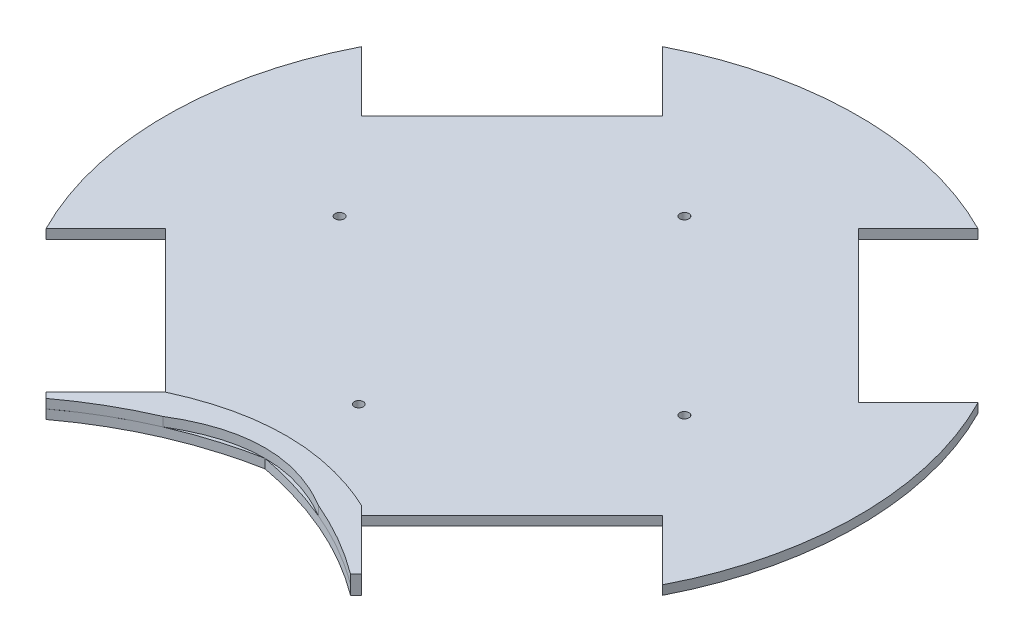
ISO-10303-21;
HEADER;
FILE_DESCRIPTION(('STEP AP214'),'2;1');
FILE_NAME('part.step','',(''),(''),'','','');
FILE_SCHEMA(('AUTOMOTIVE_DESIGN { 1 0 10303 214 1 1 1 1 }'));
ENDSEC;
DATA;
#1=APPLICATION_CONTEXT('core data for automotive mechanical design processes');
#2=APPLICATION_PROTOCOL_DEFINITION('international standard','automotive_design',2000,#1);
#3=PRODUCT_CONTEXT('',#1,'mechanical');
#4=PRODUCT('Part','Part','',(#3));
#5=PRODUCT_RELATED_PRODUCT_CATEGORY('part','',(#4));
#6=PRODUCT_DEFINITION_FORMATION('','',#4);
#7=PRODUCT_DEFINITION_CONTEXT('part definition',#1,'design');
#8=PRODUCT_DEFINITION('design','',#6,#7);
#9=PRODUCT_DEFINITION_SHAPE('','',#8);
#10=(LENGTH_UNIT() NAMED_UNIT(*) SI_UNIT(.MILLI.,.METRE.));
#11=(NAMED_UNIT(*) PLANE_ANGLE_UNIT() SI_UNIT($,.RADIAN.));
#12=(NAMED_UNIT(*) SI_UNIT($,.STERADIAN.) SOLID_ANGLE_UNIT());
#13=UNCERTAINTY_MEASURE_WITH_UNIT(LENGTH_MEASURE(1.E-05),#10,'distance_accuracy_value','');
#14=(GEOMETRIC_REPRESENTATION_CONTEXT(3) GLOBAL_UNCERTAINTY_ASSIGNED_CONTEXT((#13)) GLOBAL_UNIT_ASSIGNED_CONTEXT((#10,
#11,#12)) REPRESENTATION_CONTEXT('',''));
#15=CARTESIAN_POINT('',(0.,0.,0.));
#16=DIRECTION('',(0.,0.,1.));
#17=DIRECTION('',(1.,0.,0.));
#18=AXIS2_PLACEMENT_3D('',#15,#16,#17);
#19=CARTESIAN_POINT('',(0.,3.,0.));
#20=DIRECTION('',(0.,1.,0.));
#21=DIRECTION('',(0.,0.,1.));
#22=AXIS2_PLACEMENT_3D('',#19,#20,#21);
#23=PLANE('',#22);
#24=CARTESIAN_POINT('',(-56.6309432949497,3.,0.));
#25=DIRECTION('',(0.,1.,0.));
#26=DIRECTION('',(0.,0.,1.));
#27=AXIS2_PLACEMENT_3D('',#24,#25,#26);
#28=CIRCLE('',#27,1.5);
#29=CARTESIAN_POINT('',(-56.6309432949497,3.,1.5));
#30=VERTEX_POINT('',#29);
#31=EDGE_CURVE('E961',#30,#30,#28,.T.);
#32=ORIENTED_EDGE('',*,*,#31,.F.);
#33=EDGE_LOOP('',(#32));
#34=FACE_BOUND('',#33,.T.);
#35=CARTESIAN_POINT('',(0.,3.,50.3357666781897));
#36=DIRECTION('',(0.,1.,0.));
#37=DIRECTION('',(0.,0.,1.));
#38=AXIS2_PLACEMENT_3D('',#35,#36,#37);
#39=CIRCLE('',#38,1.5);
#40=CARTESIAN_POINT('',(0.,3.,51.8357666781897));
#41=VERTEX_POINT('',#40);
#42=EDGE_CURVE('E969',#41,#41,#39,.T.);
#43=ORIENTED_EDGE('',*,*,#42,.F.);
#44=EDGE_LOOP('',(#43));
#45=FACE_BOUND('',#44,.T.);
#46=CARTESIAN_POINT('',(56.6309432949495,3.,0.));
#47=DIRECTION('',(0.,1.,0.));
#48=DIRECTION('',(0.,0.,1.));
#49=AXIS2_PLACEMENT_3D('',#46,#47,#48);
#50=CIRCLE('',#49,1.5);
#51=CARTESIAN_POINT('',(56.6309432949495,3.,1.50000000000001));
#52=VERTEX_POINT('',#51);
#53=EDGE_CURVE('E975',#52,#52,#50,.T.);
#54=ORIENTED_EDGE('',*,*,#53,.F.);
#55=EDGE_LOOP('',(#54));
#56=FACE_BOUND('',#55,.T.);
#57=CARTESIAN_POINT('',(0.,3.,-56.6309432949497));
#58=DIRECTION('',(0.,1.,0.));
#59=DIRECTION('',(0.,0.,1.));
#60=AXIS2_PLACEMENT_3D('',#57,#58,#59);
#61=CIRCLE('',#60,1.5);
#62=CARTESIAN_POINT('',(0.,3.,-55.1309432949497));
#63=VERTEX_POINT('',#62);
#64=EDGE_CURVE('E980',#63,#63,#61,.T.);
#65=ORIENTED_EDGE('',*,*,#64,.F.);
#66=EDGE_LOOP('',(#65));
#67=FACE_BOUND('',#66,.T.);
#68=DIRECTION('',(-0.707106781186548,0.,-0.707106781186548));
#69=VECTOR('',#68,1.);
#70=CARTESIAN_POINT('',(-56.8822059534205,3.,56.8822059534205));
#71=LINE('',#70,#69);
#72=CARTESIAN_POINT('',(-32.1334686118914,3.,81.6309432949497));
#73=VERTEX_POINT('',#72);
#74=CARTESIAN_POINT('',(-81.6309432949497,3.,32.1334686118914));
#75=VERTEX_POINT('',#74);
#76=EDGE_CURVE('E574',#73,#75,#71,.T.);
#77=ORIENTED_EDGE('',*,*,#76,.F.);
#78=CARTESIAN_POINT('',(-32.1334686118914,3.,81.6309432949497));
#79=CARTESIAN_POINT('',(0.,3.,66.7397090012531));
#80=CARTESIAN_POINT('',(32.1334686118914,3.,81.6309432949497));
#81=B_SPLINE_CURVE_WITH_KNOTS('',2,(#78,#79,#80),.UNSPECIFIED.,.F.,.F.,(3,3),(0.,1.),.UNSPECIFIED.);
#82=CARTESIAN_POINT('',(32.1334686118914,3.,81.6309432949497));
#83=VERTEX_POINT('',#82);
#84=EDGE_CURVE('E353',#73,#83,#81,.T.);
#85=ORIENTED_EDGE('',*,*,#84,.T.);
#86=DIRECTION('',(-0.707106781186548,0.,0.707106781186548));
#87=VECTOR('',#86,1.);
#88=CARTESIAN_POINT('',(56.8822059534205,3.,56.8822059534205));
#89=LINE('',#88,#87);
#90=CARTESIAN_POINT('',(81.6309432949497,3.,32.1334686118913));
#91=VERTEX_POINT('',#90);
#92=EDGE_CURVE('E577',#91,#83,#89,.T.);
#93=ORIENTED_EDGE('',*,*,#92,.F.);
#94=DIRECTION('',(0.707106781186548,0.,0.707106781186548));
#95=VECTOR('',#94,1.);
#96=CARTESIAN_POINT('',(24.7487373415292,3.,-24.7487373415292));
#97=LINE('',#96,#95);
#98=CARTESIAN_POINT('',(101.290691250838,3.,51.7932165677793));
#99=VERTEX_POINT('',#98);
#100=EDGE_CURVE('E580',#91,#99,#97,.T.);
#101=ORIENTED_EDGE('',*,*,#100,.T.);
#102=CARTESIAN_POINT('',(0.,3.,0.));
#103=DIRECTION('',(0.,1.,0.));
#104=DIRECTION('',(0.,0.,1.));
#105=AXIS2_PLACEMENT_3D('',#102,#103,#104);
#106=CIRCLE('',#105,113.764411906841);
#107=CARTESIAN_POINT('',(101.290691250837,3.,-51.7932165677795));
#108=VERTEX_POINT('',#107);
#109=EDGE_CURVE('E582',#99,#108,#106,.T.);
#110=ORIENTED_EDGE('',*,*,#109,.T.);
#111=DIRECTION('',(0.707106781186546,0.,-0.707106781186549));
#112=VECTOR('',#111,1.);
#113=CARTESIAN_POINT('',(24.7487373415291,3.,24.748737341529));
#114=LINE('',#113,#112);
#115=CARTESIAN_POINT('',(81.6309432949495,3.,-32.1334686118916));
#116=VERTEX_POINT('',#115);
#117=EDGE_CURVE('E550',#116,#108,#114,.T.);
#118=ORIENTED_EDGE('',*,*,#117,.F.);
#119=DIRECTION('',(0.707106781186548,0.,0.707106781186548));
#120=VECTOR('',#119,1.);
#121=CARTESIAN_POINT('',(56.8822059534205,3.,-56.8822059534205));
#122=LINE('',#121,#120);
#123=CARTESIAN_POINT('',(32.1334686118912,3.,-81.6309432949499));
#124=VERTEX_POINT('',#123);
#125=EDGE_CURVE('E553',#124,#116,#122,.T.);
#126=ORIENTED_EDGE('',*,*,#125,.F.);
#127=DIRECTION('',(0.707106781186546,0.,-0.707106781186549));
#128=VECTOR('',#127,1.);
#129=CARTESIAN_POINT('',(-24.7487373415293,3.,-24.7487373415292));
#130=LINE('',#129,#128);
#131=CARTESIAN_POINT('',(51.793216567779,3.,-101.290691250838));
#132=VERTEX_POINT('',#131);
#133=EDGE_CURVE('E557',#124,#132,#130,.T.);
#134=ORIENTED_EDGE('',*,*,#133,.T.);
#135=CARTESIAN_POINT('',(0.,3.,0.));
#136=DIRECTION('',(0.,1.,0.));
#137=DIRECTION('',(0.,0.,1.));
#138=AXIS2_PLACEMENT_3D('',#135,#136,#137);
#139=CIRCLE('',#138,113.764411906841);
#140=CARTESIAN_POINT('',(-51.7932165677792,3.,-101.290691250838));
#141=VERTEX_POINT('',#140);
#142=EDGE_CURVE('E559',#132,#141,#139,.T.);
#143=ORIENTED_EDGE('',*,*,#142,.T.);
#144=DIRECTION('',(-0.707106781186547,0.,-0.707106781186548));
#145=VECTOR('',#144,1.);
#146=CARTESIAN_POINT('',(24.7487373415292,3.,-24.7487373415292));
#147=LINE('',#146,#145);
#148=CARTESIAN_POINT('',(-32.1334686118913,3.,-81.6309432949497));
#149=VERTEX_POINT('',#148);
#150=EDGE_CURVE('E561',#149,#141,#147,.T.);
#151=ORIENTED_EDGE('',*,*,#150,.F.);
#152=DIRECTION('',(0.707106781186548,0.,-0.707106781186548));
#153=VECTOR('',#152,1.);
#154=CARTESIAN_POINT('',(-56.8822059534205,3.,-56.8822059534205));
#155=LINE('',#154,#153);
#156=CARTESIAN_POINT('',(-81.6309432949496,3.,-32.1334686118915));
#157=VERTEX_POINT('',#156);
#158=EDGE_CURVE('E564',#157,#149,#155,.T.);
#159=ORIENTED_EDGE('',*,*,#158,.F.);
#160=DIRECTION('',(-0.707106781186547,0.,-0.707106781186548));
#161=VECTOR('',#160,1.);
#162=CARTESIAN_POINT('',(-24.7487373415291,3.,24.7487373415291));
#163=LINE('',#162,#161);
#164=CARTESIAN_POINT('',(-101.290691250838,3.,-51.7932165677794));
#165=VERTEX_POINT('',#164);
#166=EDGE_CURVE('E567',#157,#165,#163,.T.);
#167=ORIENTED_EDGE('',*,*,#166,.T.);
#168=CARTESIAN_POINT('',(0.,3.,0.));
#169=DIRECTION('',(0.,1.,0.));
#170=DIRECTION('',(0.,0.,1.));
#171=AXIS2_PLACEMENT_3D('',#168,#169,#170);
#172=CIRCLE('',#171,113.764411906841);
#173=CARTESIAN_POINT('',(-101.290691250838,3.,51.7932165677793));
#174=VERTEX_POINT('',#173);
#175=EDGE_CURVE('E569',#165,#174,#172,.T.);
#176=ORIENTED_EDGE('',*,*,#175,.T.);
#177=DIRECTION('',(-0.707106781186547,0.,0.707106781186548));
#178=VECTOR('',#177,1.);
#179=CARTESIAN_POINT('',(-24.7487373415292,3.,-24.7487373415292));
#180=LINE('',#179,#178);
#181=EDGE_CURVE('E571',#75,#174,#180,.T.);
#182=ORIENTED_EDGE('',*,*,#181,.F.);
#183=EDGE_LOOP('',(#77,#85,#93,#101,#110,#118,#126,#134,#143,#151,#159,#167,#176,#182));
#184=FACE_BOUND('',#183,.T.);
#185=ADVANCED_FACE('F158',(#34,#45,#56,#67,#184),#23,.T.);
#186=CARTESIAN_POINT('',(-25.6595369959908,3.,88.957948864328));
#187=CARTESIAN_POINT('',(-0.319320436021414,3.,73.431682626745));
#188=CARTESIAN_POINT('',(25.0624008041194,3.,88.702011102713));
#189=B_SPLINE_CURVE_WITH_KNOTS('',2,(#186,#187,#188),.UNSPECIFIED.,.F.,.F.,(3,3),(0.,1.),.UNSPECIFIED.);
#190=CARTESIAN_POINT('',(-25.6595369960047,3.,88.9579488643403));
#191=VERTEX_POINT('',#190);
#192=CARTESIAN_POINT('',(2.21256346577547E-09,3.,81.1304149397444));
#193=VERTEX_POINT('',#192);
#194=EDGE_CURVE('E338',#191,#193,#189,.T.);
#195=ORIENTED_EDGE('',*,*,#194,.F.);
#196=CARTESIAN_POINT('',(-50.0254496148129,3.,103.058458203804));
#197=CARTESIAN_POINT('',(-27.4978088580856,3.,86.3398498442306));
#198=CARTESIAN_POINT('',(2.10931108567009E-09,3.,81.1304149397643));
#199=B_SPLINE_CURVE_WITH_KNOTS('',2,(#196,#197,#198),.UNSPECIFIED.,.F.,.F.,(3,3),(0.,1.),.UNSPECIFIED.);
#200=EDGE_CURVE('E351',#191,#193,#199,.T.);
#201=ORIENTED_EDGE('',*,*,#200,.T.);
#202=EDGE_LOOP('',(#195,#201));
#203=FACE_BOUND('',#202,.T.);
#204=ADVANCED_FACE('F350',(#203),#23,.T.);
#205=CARTESIAN_POINT('',(25.0624008041194,3.,88.702011102713));
#206=VERTEX_POINT('',#205);
#207=EDGE_CURVE('E162',#193,#206,#189,.T.);
#208=ORIENTED_EDGE('',*,*,#207,.F.);
#209=CARTESIAN_POINT('',(50.025449614813,3.,103.058458203804));
#210=CARTESIAN_POINT('',(27.4978088596419,3.,86.3398498458796));
#211=CARTESIAN_POINT('',(2.10931108567009E-09,3.,81.1304149397643));
#212=B_SPLINE_CURVE_WITH_KNOTS('',2,(#209,#210,#211),.UNSPECIFIED.,.F.,.F.,(3,3),(0.,1.),.UNSPECIFIED.);
#213=EDGE_CURVE('E442',#206,#193,#212,.T.);
#214=ORIENTED_EDGE('',*,*,#213,.F.);
#215=EDGE_LOOP('',(#208,#214));
#216=FACE_BOUND('',#215,.T.);
#217=ADVANCED_FACE('F504',(#216),#23,.T.);
#218=CARTESIAN_POINT('',(-51.7932165677793,3.,101.290691250838));
#219=CARTESIAN_POINT('',(-30.7266752592655,3.,78.8977866264112));
#220=CARTESIAN_POINT('',(2.10931108567009E-09,3.,81.1304149397643));
#221=B_SPLINE_CURVE_WITH_KNOTS('',2,(#218,#219,#220),.UNSPECIFIED.,.F.,.F.,(3,3),(0.,1.),.UNSPECIFIED.);
#222=CARTESIAN_POINT('',(-51.7932165677793,3.,101.290691250838));
#223=VERTEX_POINT('',#222);
#224=CARTESIAN_POINT('',(-48.4754965416059,3.,97.9729712246642));
#225=VERTEX_POINT('',#224);
#226=EDGE_CURVE('E432',#223,#225,#221,.T.);
#227=ORIENTED_EDGE('',*,*,#226,.F.);
#228=DIRECTION('',(0.707106781186549,0.,-0.707106781186546));
#229=VECTOR('',#228,1.);
#230=CARTESIAN_POINT('',(-51.7932165677793,3.,101.290691250838));
#231=LINE('',#230,#229);
#232=EDGE_CURVE('E377',#223,#225,#231,.T.);
#233=ORIENTED_EDGE('',*,*,#232,.T.);
#234=EDGE_LOOP('',(#227,#233));
#235=FACE_BOUND('',#234,.T.);
#236=ADVANCED_FACE('F512',(#235),#23,.T.);
#237=CARTESIAN_POINT('',(24.7487373415292,3.,24.7487373415292));
#238=DIRECTION('',(0.707106781186547,0.,0.707106781186548));
#239=DIRECTION('',(0.707106781186548,0.,-0.707106781186547));
#240=AXIS2_PLACEMENT_3D('',#237,#238,#239);
#241=PLANE('',#240);
#242=DIRECTION('',(0.,1.,0.));
#243=VECTOR('',#242,1.);
#244=CARTESIAN_POINT('',(-48.4754965416059,0.,97.9729712246642));
#245=LINE('',#244,#243);
#246=CARTESIAN_POINT('',(-48.4754965416059,0.,97.9729712246642));
#247=VERTEX_POINT('',#246);
#248=EDGE_CURVE('E536',#225,#247,#245,.F.);
#249=ORIENTED_EDGE('',*,*,#248,.F.);
#250=ORIENTED_EDGE('',*,*,#232,.F.);
#251=DIRECTION('',(0.,-1.,0.));
#252=VECTOR('',#251,1.);
#253=CARTESIAN_POINT('',(-51.7932165677793,6.,101.290691250838));
#254=LINE('',#253,#252);
#255=CARTESIAN_POINT('',(-51.7932165677793,6.,101.290691250838));
#256=VERTEX_POINT('',#255);
#257=EDGE_CURVE('E445',#256,#223,#254,.T.);
#258=ORIENTED_EDGE('',*,*,#257,.F.);
#259=DIRECTION('',(0.707106781186549,0.,-0.707106781186546));
#260=VECTOR('',#259,1.);
#261=CARTESIAN_POINT('',(-51.7932165677793,6.,101.290691250838));
#262=LINE('',#261,#260);
#263=CARTESIAN_POINT('',(-32.1334686118914,6.,81.6309432949497));
#264=VERTEX_POINT('',#263);
#265=EDGE_CURVE('E367',#256,#264,#262,.T.);
#266=ORIENTED_EDGE('',*,*,#265,.T.);
#267=DIRECTION('',(0.,-1.,0.));
#268=VECTOR('',#267,1.);
#269=CARTESIAN_POINT('',(-32.1334686118914,6.,81.6309432949497));
#270=LINE('',#269,#268);
#271=EDGE_CURVE('E346',#264,#73,#270,.T.);
#272=ORIENTED_EDGE('',*,*,#271,.T.);
#273=DIRECTION('',(0.,-1.,0.));
#274=VECTOR('',#273,1.);
#275=CARTESIAN_POINT('',(-32.1334686118914,3.,81.6309432949497));
#276=LINE('',#275,#274);
#277=CARTESIAN_POINT('',(-32.1334686118914,0.,81.6309432949497));
#278=VERTEX_POINT('',#277);
#279=EDGE_CURVE('E630',#73,#278,#276,.T.);
#280=ORIENTED_EDGE('',*,*,#279,.T.);
#281=DIRECTION('',(-0.707106781186548,0.,0.707106781186547));
#282=VECTOR('',#281,1.);
#283=CARTESIAN_POINT('',(24.7487373415292,0.,24.7487373415292));
#284=LINE('',#283,#282);
#285=EDGE_CURVE('E538',#278,#247,#284,.T.);
#286=ORIENTED_EDGE('',*,*,#285,.T.);
#287=EDGE_LOOP('',(#249,#250,#258,#266,#272,#280,#286));
#288=FACE_BOUND('',#287,.T.);
#289=ADVANCED_FACE('F511',(#288),#241,.F.);
#290=CARTESIAN_POINT('',(-25.6595369959908,3.,88.957948864328));
#291=CARTESIAN_POINT('',(-38.6590281780498,3.,94.5958917245287));
#292=CARTESIAN_POINT('',(-50.0254496148129,3.,103.058458203804));
#293=B_SPLINE_CURVE_WITH_KNOTS('',2,(#290,#291,#292),.UNSPECIFIED.,.F.,.F.,(3,3),(0.,1.),.UNSPECIFIED.);
#294=CARTESIAN_POINT('',(-38.1662606940839,3.,95.2531940890157));
#295=VERTEX_POINT('',#294);
#296=CARTESIAN_POINT('',(-50.0254496148129,3.,103.058458203804));
#297=VERTEX_POINT('',#296);
#298=EDGE_CURVE('E369',#295,#297,#293,.T.);
#299=ORIENTED_EDGE('',*,*,#298,.T.);
#300=EDGE_CURVE('E362',#297,#295,#199,.T.);
#301=ORIENTED_EDGE('',*,*,#300,.T.);
#302=EDGE_LOOP('',(#299,#301));
#303=FACE_BOUND('',#302,.T.);
#304=ADVANCED_FACE('F500',(#303),#23,.T.);
#305=CARTESIAN_POINT('',(0.,0.,0.));
#306=DIRECTION('',(0.,1.,0.));
#307=DIRECTION('',(0.,0.,1.));
#308=AXIS2_PLACEMENT_3D('',#305,#306,#307);
#309=PLANE('',#308);
#310=CARTESIAN_POINT('',(-56.6309432949497,0.,0.));
#311=DIRECTION('',(0.,1.,0.));
#312=DIRECTION('',(0.,0.,1.));
#313=AXIS2_PLACEMENT_3D('',#310,#311,#312);
#314=CIRCLE('',#313,1.5);
#315=CARTESIAN_POINT('',(-56.6309432949497,0.,1.5));
#316=VERTEX_POINT('',#315);
#317=EDGE_CURVE('E918',#316,#316,#314,.T.);
#318=ORIENTED_EDGE('',*,*,#317,.T.);
#319=EDGE_LOOP('',(#318));
#320=FACE_BOUND('',#319,.T.);
#321=CARTESIAN_POINT('',(0.,0.,50.3357666781897));
#322=DIRECTION('',(0.,1.,0.));
#323=DIRECTION('',(0.,0.,1.));
#324=AXIS2_PLACEMENT_3D('',#321,#322,#323);
#325=CIRCLE('',#324,1.5);
#326=CARTESIAN_POINT('',(0.,0.,51.8357666781897));
#327=VERTEX_POINT('',#326);
#328=EDGE_CURVE('E964',#327,#327,#325,.T.);
#329=ORIENTED_EDGE('',*,*,#328,.T.);
#330=EDGE_LOOP('',(#329));
#331=FACE_BOUND('',#330,.T.);
#332=CARTESIAN_POINT('',(56.6309432949495,0.,0.));
#333=DIRECTION('',(0.,1.,0.));
#334=DIRECTION('',(0.,0.,1.));
#335=AXIS2_PLACEMENT_3D('',#332,#333,#334);
#336=CIRCLE('',#335,1.5);
#337=CARTESIAN_POINT('',(56.6309432949495,0.,1.50000000000001));
#338=VERTEX_POINT('',#337);
#339=EDGE_CURVE('E972',#338,#338,#336,.T.);
#340=ORIENTED_EDGE('',*,*,#339,.T.);
#341=EDGE_LOOP('',(#340));
#342=FACE_BOUND('',#341,.T.);
#343=CARTESIAN_POINT('',(0.,0.,-56.6309432949497));
#344=DIRECTION('',(0.,1.,0.));
#345=DIRECTION('',(0.,0.,1.));
#346=AXIS2_PLACEMENT_3D('',#343,#344,#345);
#347=CIRCLE('',#346,1.5);
#348=CARTESIAN_POINT('',(0.,0.,-55.1309432949497));
#349=VERTEX_POINT('',#348);
#350=EDGE_CURVE('E978',#349,#349,#347,.T.);
#351=ORIENTED_EDGE('',*,*,#350,.T.);
#352=EDGE_LOOP('',(#351));
#353=FACE_BOUND('',#352,.T.);
#354=DIRECTION('',(0.707106781186547,0.,0.707106781186548));
#355=VECTOR('',#354,1.);
#356=CARTESIAN_POINT('',(-24.7487373415292,0.,24.7487373415291));
#357=LINE('',#356,#355);
#358=CARTESIAN_POINT('',(32.1334686118914,0.,81.6309432949497));
#359=VERTEX_POINT('',#358);
#360=CARTESIAN_POINT('',(51.7932165677793,0.,101.290691250838));
#361=VERTEX_POINT('',#360);
#362=EDGE_CURVE('E610',#359,#361,#357,.T.);
#363=ORIENTED_EDGE('',*,*,#362,.T.);
#364=DIRECTION('',(-0.707106781186545,0.,0.70710678118655));
#365=VECTOR('',#364,1.);
#366=CARTESIAN_POINT('',(76.5419539093086,0.,76.541953909308));
#367=LINE('',#366,#365);
#368=CARTESIAN_POINT('',(50.025449614813,0.,103.058458203804));
#369=VERTEX_POINT('',#368);
#370=EDGE_CURVE('E426',#361,#369,#367,.T.);
#371=ORIENTED_EDGE('',*,*,#370,.T.);
#372=CARTESIAN_POINT('',(50.025449614813,0.,103.058458203804));
#373=CARTESIAN_POINT('',(27.4978088596419,0.,86.3398498458796));
#374=CARTESIAN_POINT('',(2.10931108567009E-09,0.,81.1304149397643));
#375=B_SPLINE_CURVE_WITH_KNOTS('',2,(#372,#373,#374),.UNSPECIFIED.,.F.,.F.,(3,3),(0.,1.),.UNSPECIFIED.);
#376=CARTESIAN_POINT('',(2.92219963504703E-08,0.,81.1304149398078));
#377=VERTEX_POINT('',#376);
#378=EDGE_CURVE('E420',#369,#377,#375,.T.);
#379=ORIENTED_EDGE('',*,*,#378,.T.);
#380=CARTESIAN_POINT('',(-50.0254496148129,0.,103.058458203804));
#381=CARTESIAN_POINT('',(-27.4978088580856,0.,86.3398498442306));
#382=CARTESIAN_POINT('',(2.10931108567009E-09,0.,81.1304149397643));
#383=B_SPLINE_CURVE_WITH_KNOTS('',2,(#380,#381,#382),.UNSPECIFIED.,.F.,.F.,(3,3),(0.,1.),.UNSPECIFIED.);
#384=CARTESIAN_POINT('',(-50.0254496148129,0.,103.058458203804));
#385=VERTEX_POINT('',#384);
#386=EDGE_CURVE('E712',#385,#377,#383,.T.);
#387=ORIENTED_EDGE('',*,*,#386,.F.);
#388=DIRECTION('',(0.707106781186549,0.,0.707106781186546));
#389=VECTOR('',#388,1.);
#390=CARTESIAN_POINT('',(-76.5419539093083,0.,76.5419539093086));
#391=LINE('',#390,#389);
#392=CARTESIAN_POINT('',(-51.7932165677793,0.,101.290691250838));
#393=VERTEX_POINT('',#392);
#394=EDGE_CURVE('E437',#393,#385,#391,.T.);
#395=ORIENTED_EDGE('',*,*,#394,.F.);
#396=CARTESIAN_POINT('',(-51.7932165677793,0.,101.290691250838));
#397=CARTESIAN_POINT('',(-30.7266752592655,0.,78.8977866264112));
#398=CARTESIAN_POINT('',(2.10931108567009E-09,0.,81.1304149397643));
#399=B_SPLINE_CURVE_WITH_KNOTS('',2,(#396,#397,#398),.UNSPECIFIED.,.F.,.F.,(3,3),(0.,1.),.UNSPECIFIED.);
#400=EDGE_CURVE('E360',#393,#247,#399,.T.);
#401=ORIENTED_EDGE('',*,*,#400,.T.);
#402=ORIENTED_EDGE('',*,*,#285,.F.);
#403=DIRECTION('',(-0.707106781186548,0.,-0.707106781186548));
#404=VECTOR('',#403,1.);
#405=CARTESIAN_POINT('',(-56.8822059534205,0.,56.8822059534205));
#406=LINE('',#405,#404);
#407=CARTESIAN_POINT('',(-81.6309432949497,0.,32.1334686118914));
#408=VERTEX_POINT('',#407);
#409=EDGE_CURVE('E606',#278,#408,#406,.T.);
#410=ORIENTED_EDGE('',*,*,#409,.T.);
#411=DIRECTION('',(-0.707106781186547,0.,0.707106781186548));
#412=VECTOR('',#411,1.);
#413=CARTESIAN_POINT('',(-24.7487373415292,0.,-24.7487373415292));
#414=LINE('',#413,#412);
#415=CARTESIAN_POINT('',(-101.290691250838,0.,51.7932165677793));
#416=VERTEX_POINT('',#415);
#417=EDGE_CURVE('E603',#408,#416,#414,.T.);
#418=ORIENTED_EDGE('',*,*,#417,.T.);
#419=CARTESIAN_POINT('',(0.,0.,0.));
#420=DIRECTION('',(0.,1.,0.));
#421=DIRECTION('',(0.,0.,1.));
#422=AXIS2_PLACEMENT_3D('',#419,#420,#421);
#423=CIRCLE('',#422,113.764411906841);
#424=CARTESIAN_POINT('',(-101.290691250838,0.,-51.7932165677794));
#425=VERTEX_POINT('',#424);
#426=EDGE_CURVE('E600',#425,#416,#423,.T.);
#427=ORIENTED_EDGE('',*,*,#426,.F.);
#428=DIRECTION('',(-0.707106781186547,0.,-0.707106781186548));
#429=VECTOR('',#428,1.);
#430=CARTESIAN_POINT('',(-24.7487373415291,0.,24.7487373415291));
#431=LINE('',#430,#429);
#432=CARTESIAN_POINT('',(-81.6309432949496,0.,-32.1334686118915));
#433=VERTEX_POINT('',#432);
#434=EDGE_CURVE('E598',#433,#425,#431,.T.);
#435=ORIENTED_EDGE('',*,*,#434,.F.);
#436=DIRECTION('',(0.707106781186548,0.,-0.707106781186548));
#437=VECTOR('',#436,1.);
#438=CARTESIAN_POINT('',(-56.8822059534205,0.,-56.8822059534205));
#439=LINE('',#438,#437);
#440=CARTESIAN_POINT('',(-32.1334686118913,0.,-81.6309432949497));
#441=VERTEX_POINT('',#440);
#442=EDGE_CURVE('E595',#433,#441,#439,.T.);
#443=ORIENTED_EDGE('',*,*,#442,.T.);
#444=DIRECTION('',(-0.707106781186547,0.,-0.707106781186548));
#445=VECTOR('',#444,1.);
#446=CARTESIAN_POINT('',(24.7487373415292,0.,-24.7487373415292));
#447=LINE('',#446,#445);
#448=CARTESIAN_POINT('',(-51.7932165677792,0.,-101.290691250838));
#449=VERTEX_POINT('',#448);
#450=EDGE_CURVE('E592',#441,#449,#447,.T.);
#451=ORIENTED_EDGE('',*,*,#450,.T.);
#452=CARTESIAN_POINT('',(0.,0.,0.));
#453=DIRECTION('',(0.,1.,0.));
#454=DIRECTION('',(0.,0.,1.));
#455=AXIS2_PLACEMENT_3D('',#452,#453,#454);
#456=CIRCLE('',#455,113.764411906841);
#457=CARTESIAN_POINT('',(51.793216567779,0.,-101.290691250838));
#458=VERTEX_POINT('',#457);
#459=EDGE_CURVE('E589',#458,#449,#456,.T.);
#460=ORIENTED_EDGE('',*,*,#459,.F.);
#461=DIRECTION('',(0.707106781186546,0.,-0.707106781186549));
#462=VECTOR('',#461,1.);
#463=CARTESIAN_POINT('',(-24.7487373415293,0.,-24.7487373415292));
#464=LINE('',#463,#462);
#465=CARTESIAN_POINT('',(32.1334686118912,0.,-81.6309432949499));
#466=VERTEX_POINT('',#465);
#467=EDGE_CURVE('E587',#466,#458,#464,.T.);
#468=ORIENTED_EDGE('',*,*,#467,.F.);
#469=DIRECTION('',(0.707106781186548,0.,0.707106781186548));
#470=VECTOR('',#469,1.);
#471=CARTESIAN_POINT('',(56.8822059534205,0.,-56.8822059534205));
#472=LINE('',#471,#470);
#473=CARTESIAN_POINT('',(81.6309432949495,0.,-32.1334686118916));
#474=VERTEX_POINT('',#473);
#475=EDGE_CURVE('E543',#466,#474,#472,.T.);
#476=ORIENTED_EDGE('',*,*,#475,.T.);
#477=DIRECTION('',(0.707106781186546,0.,-0.707106781186549));
#478=VECTOR('',#477,1.);
#479=CARTESIAN_POINT('',(24.7487373415291,0.,24.748737341529));
#480=LINE('',#479,#478);
#481=CARTESIAN_POINT('',(101.290691250837,0.,-51.7932165677795));
#482=VERTEX_POINT('',#481);
#483=EDGE_CURVE('E540',#474,#482,#480,.T.);
#484=ORIENTED_EDGE('',*,*,#483,.T.);
#485=CARTESIAN_POINT('',(0.,0.,0.));
#486=DIRECTION('',(0.,1.,0.));
#487=DIRECTION('',(0.,0.,1.));
#488=AXIS2_PLACEMENT_3D('',#485,#486,#487);
#489=CIRCLE('',#488,113.764411906841);
#490=CARTESIAN_POINT('',(101.290691250838,0.,51.7932165677793));
#491=VERTEX_POINT('',#490);
#492=EDGE_CURVE('E554',#491,#482,#489,.T.);
#493=ORIENTED_EDGE('',*,*,#492,.F.);
#494=DIRECTION('',(0.707106781186548,0.,0.707106781186548));
#495=VECTOR('',#494,1.);
#496=CARTESIAN_POINT('',(24.7487373415292,0.,-24.7487373415292));
#497=LINE('',#496,#495);
#498=CARTESIAN_POINT('',(81.6309432949497,0.,32.1334686118913));
#499=VERTEX_POINT('',#498);
#500=EDGE_CURVE('E615',#499,#491,#497,.T.);
#501=ORIENTED_EDGE('',*,*,#500,.F.);
#502=DIRECTION('',(-0.707106781186548,0.,0.707106781186548));
#503=VECTOR('',#502,1.);
#504=CARTESIAN_POINT('',(56.8822059534205,0.,56.8822059534205));
#505=LINE('',#504,#503);
#506=EDGE_CURVE('E612',#499,#359,#505,.T.);
#507=ORIENTED_EDGE('',*,*,#506,.T.);
#508=EDGE_LOOP('',(#363,#371,#379,#387,#395,#401,#402,#410,#418,#427,#435,#443,#451,#460,#468,
#476,#484,#493,#501,#507));
#509=FACE_BOUND('',#508,.T.);
#510=ADVANCED_FACE('F510',(#320,#331,#342,#353,#509),#309,.F.);
#511=CARTESIAN_POINT('',(24.7487373415291,3.,24.748737341529));
#512=DIRECTION('',(-0.707106781186548,0.,-0.707106781186546));
#513=DIRECTION('',(-0.707106781186546,0.,0.707106781186549));
#514=AXIS2_PLACEMENT_3D('',#511,#512,#513);
#515=PLANE('',#514);
#516=ORIENTED_EDGE('',*,*,#483,.F.);
#517=DIRECTION('',(0.,-1.,0.));
#518=VECTOR('',#517,1.);
#519=CARTESIAN_POINT('',(81.6309432949495,3.,-32.1334686118916));
#520=LINE('',#519,#518);
#521=EDGE_CURVE('E12',#116,#474,#520,.T.);
#522=ORIENTED_EDGE('',*,*,#521,.F.);
#523=ORIENTED_EDGE('',*,*,#117,.T.);
#524=DIRECTION('',(0.,-1.,0.));
#525=VECTOR('',#524,1.);
#526=CARTESIAN_POINT('',(101.290691250837,3.,-51.7932165677795));
#527=LINE('',#526,#525);
#528=EDGE_CURVE('E583',#108,#482,#527,.T.);
#529=ORIENTED_EDGE('',*,*,#528,.T.);
#530=EDGE_LOOP('',(#516,#522,#523,#529));
#531=FACE_BOUND('',#530,.T.);
#532=ADVANCED_FACE('F160',(#531),#515,.T.);
#533=CARTESIAN_POINT('',(56.8822059534205,3.,-56.8822059534205));
#534=DIRECTION('',(0.707106781186547,0.,-0.707106781186547));
#535=DIRECTION('',(-0.707106781186548,0.,-0.707106781186548));
#536=AXIS2_PLACEMENT_3D('',#533,#534,#535);
#537=PLANE('',#536);
#538=ORIENTED_EDGE('',*,*,#475,.F.);
#539=DIRECTION('',(0.,-1.,0.));
#540=VECTOR('',#539,1.);
#541=CARTESIAN_POINT('',(32.1334686118912,3.,-81.6309432949499));
#542=LINE('',#541,#540);
#543=EDGE_CURVE('E169',#124,#466,#542,.T.);
#544=ORIENTED_EDGE('',*,*,#543,.F.);
#545=ORIENTED_EDGE('',*,*,#125,.T.);
#546=ORIENTED_EDGE('',*,*,#521,.T.);
#547=EDGE_LOOP('',(#538,#544,#545,#546));
#548=FACE_BOUND('',#547,.T.);
#549=ADVANCED_FACE('F657',(#548),#537,.T.);
#550=CARTESIAN_POINT('',(-24.7487373415293,3.,-24.7487373415292));
#551=DIRECTION('',(-0.707106781186548,0.,-0.707106781186546));
#552=DIRECTION('',(-0.707106781186546,0.,0.707106781186549));
#553=AXIS2_PLACEMENT_3D('',#550,#551,#552);
#554=PLANE('',#553);
#555=ORIENTED_EDGE('',*,*,#467,.T.);
#556=DIRECTION('',(0.,-1.,0.));
#557=VECTOR('',#556,1.);
#558=CARTESIAN_POINT('',(51.793216567779,3.,-101.290691250838));
#559=LINE('',#558,#557);
#560=EDGE_CURVE('E645',#132,#458,#559,.T.);
#561=ORIENTED_EDGE('',*,*,#560,.F.);
#562=ORIENTED_EDGE('',*,*,#133,.F.);
#563=ORIENTED_EDGE('',*,*,#543,.T.);
#564=EDGE_LOOP('',(#555,#561,#562,#563));
#565=FACE_BOUND('',#564,.T.);
#566=ADVANCED_FACE('F650',(#565),#554,.F.);
#567=CARTESIAN_POINT('',(0.,3.,0.));
#568=DIRECTION('',(0.,-1.,0.));
#569=DIRECTION('',(0.,0.,-1.));
#570=AXIS2_PLACEMENT_3D('',#567,#568,#569);
#571=CYLINDRICAL_SURFACE('',#570,113.764411906841);
#572=ORIENTED_EDGE('',*,*,#459,.T.);
#573=DIRECTION('',(0.,-1.,0.));
#574=VECTOR('',#573,1.);
#575=CARTESIAN_POINT('',(-51.7932165677792,3.,-101.290691250838));
#576=LINE('',#575,#574);
#577=EDGE_CURVE('E643',#141,#449,#576,.T.);
#578=ORIENTED_EDGE('',*,*,#577,.F.);
#579=ORIENTED_EDGE('',*,*,#142,.F.);
#580=ORIENTED_EDGE('',*,*,#560,.T.);
#581=EDGE_LOOP('',(#572,#578,#579,#580));
#582=FACE_BOUND('',#581,.T.);
#583=ADVANCED_FACE('F816',(#582),#571,.T.);
#584=CARTESIAN_POINT('',(24.7487373415292,3.,-24.7487373415292));
#585=DIRECTION('',(-0.707106781186548,0.,0.707106781186547));
#586=DIRECTION('',(0.707106781186547,0.,0.707106781186548));
#587=AXIS2_PLACEMENT_3D('',#584,#585,#586);
#588=PLANE('',#587);
#589=ORIENTED_EDGE('',*,*,#450,.F.);
#590=DIRECTION('',(0.,-1.,0.));
#591=VECTOR('',#590,1.);
#592=CARTESIAN_POINT('',(-32.1334686118913,3.,-81.6309432949497));
#593=LINE('',#592,#591);
#594=EDGE_CURVE('E641',#149,#441,#593,.T.);
#595=ORIENTED_EDGE('',*,*,#594,.F.);
#596=ORIENTED_EDGE('',*,*,#150,.T.);
#597=ORIENTED_EDGE('',*,*,#577,.T.);
#598=EDGE_LOOP('',(#589,#595,#596,#597));
#599=FACE_BOUND('',#598,.T.);
#600=ADVANCED_FACE('F808',(#599),#588,.T.);
#601=CARTESIAN_POINT('',(-56.8822059534205,3.,-56.8822059534205));
#602=DIRECTION('',(-0.707106781186547,0.,-0.707106781186547));
#603=DIRECTION('',(-0.707106781186548,0.,0.707106781186548));
#604=AXIS2_PLACEMENT_3D('',#601,#602,#603);
#605=PLANE('',#604);
#606=ORIENTED_EDGE('',*,*,#442,.F.);
#607=DIRECTION('',(0.,-1.,0.));
#608=VECTOR('',#607,1.);
#609=CARTESIAN_POINT('',(-81.6309432949496,3.,-32.1334686118915));
#610=LINE('',#609,#608);
#611=EDGE_CURVE('E639',#157,#433,#610,.T.);
#612=ORIENTED_EDGE('',*,*,#611,.F.);
#613=ORIENTED_EDGE('',*,*,#158,.T.);
#614=ORIENTED_EDGE('',*,*,#594,.T.);
#615=EDGE_LOOP('',(#606,#612,#613,#614));
#616=FACE_BOUND('',#615,.T.);
#617=ADVANCED_FACE('F800',(#616),#605,.T.);
#618=CARTESIAN_POINT('',(-24.7487373415291,3.,24.7487373415291));
#619=DIRECTION('',(-0.707106781186548,0.,0.707106781186547));
#620=DIRECTION('',(0.707106781186547,0.,0.707106781186548));
#621=AXIS2_PLACEMENT_3D('',#618,#619,#620);
#622=PLANE('',#621);
#623=ORIENTED_EDGE('',*,*,#434,.T.);
#624=DIRECTION('',(0.,-1.,0.));
#625=VECTOR('',#624,1.);
#626=CARTESIAN_POINT('',(-101.290691250838,3.,-51.7932165677794));
#627=LINE('',#626,#625);
#628=EDGE_CURVE('E636',#165,#425,#627,.T.);
#629=ORIENTED_EDGE('',*,*,#628,.F.);
#630=ORIENTED_EDGE('',*,*,#166,.F.);
#631=ORIENTED_EDGE('',*,*,#611,.T.);
#632=EDGE_LOOP('',(#623,#629,#630,#631));
#633=FACE_BOUND('',#632,.T.);
#634=ADVANCED_FACE('F792',(#633),#622,.F.);
#635=CARTESIAN_POINT('',(0.,3.,0.));
#636=DIRECTION('',(0.,-1.,0.));
#637=DIRECTION('',(0.,0.,-1.));
#638=AXIS2_PLACEMENT_3D('',#635,#636,#637);
#639=CYLINDRICAL_SURFACE('',#638,113.764411906841);
#640=ORIENTED_EDGE('',*,*,#426,.T.);
#641=DIRECTION('',(0.,-1.,0.));
#642=VECTOR('',#641,1.);
#643=CARTESIAN_POINT('',(-101.290691250838,3.,51.7932165677793));
#644=LINE('',#643,#642);
#645=EDGE_CURVE('E634',#174,#416,#644,.T.);
#646=ORIENTED_EDGE('',*,*,#645,.F.);
#647=ORIENTED_EDGE('',*,*,#175,.F.);
#648=ORIENTED_EDGE('',*,*,#628,.T.);
#649=EDGE_LOOP('',(#640,#646,#647,#648));
#650=FACE_BOUND('',#649,.T.);
#651=ADVANCED_FACE('F784',(#650),#639,.T.);
#652=CARTESIAN_POINT('',(-24.7487373415292,3.,-24.7487373415292));
#653=DIRECTION('',(0.707106781186548,0.,0.707106781186547));
#654=DIRECTION('',(0.707106781186547,0.,-0.707106781186548));
#655=AXIS2_PLACEMENT_3D('',#652,#653,#654);
#656=PLANE('',#655);
#657=ORIENTED_EDGE('',*,*,#417,.F.);
#658=DIRECTION('',(0.,-1.,0.));
#659=VECTOR('',#658,1.);
#660=CARTESIAN_POINT('',(-81.6309432949497,3.,32.1334686118914));
#661=LINE('',#660,#659);
#662=EDGE_CURVE('E632',#75,#408,#661,.T.);
#663=ORIENTED_EDGE('',*,*,#662,.F.);
#664=ORIENTED_EDGE('',*,*,#181,.T.);
#665=ORIENTED_EDGE('',*,*,#645,.T.);
#666=EDGE_LOOP('',(#657,#663,#664,#665));
#667=FACE_BOUND('',#666,.T.);
#668=ADVANCED_FACE('F776',(#667),#656,.T.);
#669=CARTESIAN_POINT('',(-56.8822059534205,3.,56.8822059534205));
#670=DIRECTION('',(-0.707106781186547,0.,0.707106781186547));
#671=DIRECTION('',(0.707106781186548,0.,0.707106781186548));
#672=AXIS2_PLACEMENT_3D('',#669,#670,#671);
#673=PLANE('',#672);
#674=ORIENTED_EDGE('',*,*,#409,.F.);
#675=ORIENTED_EDGE('',*,*,#279,.F.);
#676=ORIENTED_EDGE('',*,*,#76,.T.);
#677=ORIENTED_EDGE('',*,*,#662,.T.);
#678=EDGE_LOOP('',(#674,#675,#676,#677));
#679=FACE_BOUND('',#678,.T.);
#680=ADVANCED_FACE('F769',(#679),#673,.T.);
#681=CARTESIAN_POINT('',(-24.7487373415292,3.,24.7487373415291));
#682=DIRECTION('',(0.707106781186548,0.,-0.707106781186547));
#683=DIRECTION('',(-0.707106781186547,0.,-0.707106781186548));
#684=AXIS2_PLACEMENT_3D('',#681,#682,#683);
#685=PLANE('',#684);
#686=DIRECTION('',(0.,-1.,0.));
#687=VECTOR('',#686,1.);
#688=CARTESIAN_POINT('',(51.7932165677793,3.,101.290691250838));
#689=LINE('',#688,#687);
#690=CARTESIAN_POINT('',(51.7932165677793,6.,101.290691250838));
#691=VERTEX_POINT('',#690);
#692=EDGE_CURVE('E627',#691,#361,#689,.T.);
#693=ORIENTED_EDGE('',*,*,#692,.T.);
#694=ORIENTED_EDGE('',*,*,#362,.F.);
#695=DIRECTION('',(0.,-1.,0.));
#696=VECTOR('',#695,1.);
#697=CARTESIAN_POINT('',(32.1334686118914,3.,81.6309432949497));
#698=LINE('',#697,#696);
#699=EDGE_CURVE('E625',#83,#359,#698,.T.);
#700=ORIENTED_EDGE('',*,*,#699,.F.);
#701=DIRECTION('',(0.,-1.,0.));
#702=VECTOR('',#701,1.);
#703=CARTESIAN_POINT('',(32.1334686118914,6.,81.6309432949497));
#704=LINE('',#703,#702);
#705=CARTESIAN_POINT('',(32.1334686118914,6.,81.6309432949497));
#706=VERTEX_POINT('',#705);
#707=EDGE_CURVE('E688',#706,#83,#704,.T.);
#708=ORIENTED_EDGE('',*,*,#707,.F.);
#709=DIRECTION('',(0.707106781186548,0.,0.707106781186547));
#710=VECTOR('',#709,1.);
#711=CARTESIAN_POINT('',(32.1334686118914,6.,81.6309432949497));
#712=LINE('',#711,#710);
#713=EDGE_CURVE('E687',#706,#691,#712,.T.);
#714=ORIENTED_EDGE('',*,*,#713,.T.);
#715=EDGE_LOOP('',(#693,#694,#700,#708,#714));
#716=FACE_BOUND('',#715,.T.);
#717=ADVANCED_FACE('F684',(#716),#685,.T.);
#718=CARTESIAN_POINT('',(56.8822059534205,3.,56.8822059534205));
#719=DIRECTION('',(0.707106781186547,0.,0.707106781186547));
#720=DIRECTION('',(0.707106781186548,0.,-0.707106781186548));
#721=AXIS2_PLACEMENT_3D('',#718,#719,#720);
#722=PLANE('',#721);
#723=ORIENTED_EDGE('',*,*,#506,.F.);
#724=DIRECTION('',(0.,-1.,0.));
#725=VECTOR('',#724,1.);
#726=CARTESIAN_POINT('',(81.6309432949497,3.,32.1334686118913));
#727=LINE('',#726,#725);
#728=EDGE_CURVE('E623',#91,#499,#727,.T.);
#729=ORIENTED_EDGE('',*,*,#728,.F.);
#730=ORIENTED_EDGE('',*,*,#92,.T.);
#731=ORIENTED_EDGE('',*,*,#699,.T.);
#732=EDGE_LOOP('',(#723,#729,#730,#731));
#733=FACE_BOUND('',#732,.T.);
#734=ADVANCED_FACE('F674',(#733),#722,.T.);
#735=CARTESIAN_POINT('',(24.7487373415292,3.,-24.7487373415292));
#736=DIRECTION('',(0.707106781186547,0.,-0.707106781186547));
#737=DIRECTION('',(-0.707106781186548,0.,-0.707106781186548));
#738=AXIS2_PLACEMENT_3D('',#735,#736,#737);
#739=PLANE('',#738);
#740=ORIENTED_EDGE('',*,*,#500,.T.);
#741=DIRECTION('',(0.,-1.,0.));
#742=VECTOR('',#741,1.);
#743=CARTESIAN_POINT('',(101.290691250838,3.,51.7932165677793));
#744=LINE('',#743,#742);
#745=EDGE_CURVE('E620',#99,#491,#744,.T.);
#746=ORIENTED_EDGE('',*,*,#745,.F.);
#747=ORIENTED_EDGE('',*,*,#100,.F.);
#748=ORIENTED_EDGE('',*,*,#728,.T.);
#749=EDGE_LOOP('',(#740,#746,#747,#748));
#750=FACE_BOUND('',#749,.T.);
#751=ADVANCED_FACE('F671',(#750),#739,.F.);
#752=CARTESIAN_POINT('',(0.,3.,0.));
#753=DIRECTION('',(0.,-1.,0.));
#754=DIRECTION('',(0.,0.,-1.));
#755=AXIS2_PLACEMENT_3D('',#752,#753,#754);
#756=CYLINDRICAL_SURFACE('',#755,113.764411906841);
#757=ORIENTED_EDGE('',*,*,#492,.T.);
#758=ORIENTED_EDGE('',*,*,#528,.F.);
#759=ORIENTED_EDGE('',*,*,#109,.F.);
#760=ORIENTED_EDGE('',*,*,#745,.T.);
#761=EDGE_LOOP('',(#757,#758,#759,#760));
#762=FACE_BOUND('',#761,.T.);
#763=ADVANCED_FACE('F666',(#762),#756,.T.);
#764=DIRECTION('',(0.,1.,0.));
#765=VECTOR('',#764,1.);
#766=SURFACE_OF_LINEAR_EXTRUSION('',#399,#765);
#767=ORIENTED_EDGE('',*,*,#226,.T.);
#768=ORIENTED_EDGE('',*,*,#248,.T.);
#769=ORIENTED_EDGE('',*,*,#400,.F.);
#770=DIRECTION('',(0.,1.,0.));
#771=VECTOR('',#770,1.);
#772=CARTESIAN_POINT('',(-51.7932165677793,0.,101.290691250838));
#773=LINE('',#772,#771);
#774=EDGE_CURVE('E532',#393,#223,#773,.T.);
#775=ORIENTED_EDGE('',*,*,#774,.T.);
#776=EDGE_LOOP('',(#767,#768,#769,#775));
#777=FACE_BOUND('',#776,.T.);
#778=ADVANCED_FACE('F731',(#777),#766,.F.);
#779=DIRECTION('',(0.,1.,0.));
#780=VECTOR('',#779,1.);
#781=SURFACE_OF_LINEAR_EXTRUSION('',#383,#780);
#782=ORIENTED_EDGE('',*,*,#300,.F.);
#783=DIRECTION('',(0.,1.,0.));
#784=VECTOR('',#783,1.);
#785=CARTESIAN_POINT('',(-50.0254496148129,0.,103.058458203804));
#786=LINE('',#785,#784);
#787=EDGE_CURVE('E713',#385,#297,#786,.T.);
#788=ORIENTED_EDGE('',*,*,#787,.F.);
#789=ORIENTED_EDGE('',*,*,#386,.T.);
#790=DIRECTION('',(0.,1.,0.));
#791=VECTOR('',#790,1.);
#792=CARTESIAN_POINT('',(2.92219963504703E-08,0.,81.1304149398078));
#793=LINE('',#792,#791);
#794=EDGE_CURVE('E358',#377,#193,#793,.T.);
#795=ORIENTED_EDGE('',*,*,#794,.T.);
#796=ORIENTED_EDGE('',*,*,#200,.F.);
#797=CARTESIAN_POINT('',(-25.6601236694942,3.,88.9582022117203));
#798=VERTEX_POINT('',#797);
#799=EDGE_CURVE('E177',#191,#798,#293,.T.);
#800=ORIENTED_EDGE('',*,*,#799,.T.);
#801=CARTESIAN_POINT('',(-38.1651346364603,3.,95.2525424756374));
#802=VERTEX_POINT('',#801);
#803=EDGE_CURVE('E359',#802,#798,#199,.T.);
#804=ORIENTED_EDGE('',*,*,#803,.F.);
#805=EDGE_CURVE('E714',#295,#802,#199,.T.);
#806=ORIENTED_EDGE('',*,*,#805,.F.);
#807=EDGE_LOOP('',(#782,#788,#789,#795,#796,#800,#804,#806));
#808=FACE_BOUND('',#807,.T.);
#809=ADVANCED_FACE('F355',(#808),#781,.T.);
#810=CARTESIAN_POINT('',(-76.5419539093083,0.,76.5419539093086));
#811=DIRECTION('',(-0.707106781186546,0.,0.707106781186549));
#812=DIRECTION('',(0.707106781186549,0.,0.707106781186546));
#813=AXIS2_PLACEMENT_3D('',#810,#811,#812);
#814=PLANE('',#813);
#815=ORIENTED_EDGE('',*,*,#787,.T.);
#816=DIRECTION('',(0.,-1.,0.));
#817=VECTOR('',#816,1.);
#818=CARTESIAN_POINT('',(-50.0254496148129,6.,103.058458203804));
#819=LINE('',#818,#817);
#820=CARTESIAN_POINT('',(-50.0254496148129,6.,103.058458203804));
#821=VERTEX_POINT('',#820);
#822=EDGE_CURVE('E345',#821,#297,#819,.T.);
#823=ORIENTED_EDGE('',*,*,#822,.F.);
#824=DIRECTION('',(0.707106781186567,0.,0.707106781186528));
#825=VECTOR('',#824,1.);
#826=CARTESIAN_POINT('',(-51.7932165677793,6.,101.290691250838));
#827=LINE('',#826,#825);
#828=EDGE_CURVE('E390',#256,#821,#827,.T.);
#829=ORIENTED_EDGE('',*,*,#828,.F.);
#830=ORIENTED_EDGE('',*,*,#257,.T.);
#831=ORIENTED_EDGE('',*,*,#774,.F.);
#832=ORIENTED_EDGE('',*,*,#394,.T.);
#833=EDGE_LOOP('',(#815,#823,#829,#830,#831,#832));
#834=FACE_BOUND('',#833,.T.);
#835=ADVANCED_FACE('F415',(#834),#814,.T.);
#836=DIRECTION('',(0.,1.,0.));
#837=VECTOR('',#836,1.);
#838=SURFACE_OF_LINEAR_EXTRUSION('',#375,#837);
#839=CARTESIAN_POINT('',(37.0379927133785,3.,94.6083360532024));
#840=CARTESIAN_POINT('',(43.7757954473234,3.,98.4046368626112));
#841=CARTESIAN_POINT('',(50.025449614813,3.,103.058458203804));
#842=B_SPLINE_CURVE_WITH_KNOTS('',2,(#839,#840,#841),.UNSPECIFIED.,.F.,.F.,(3,3),
(0.462880695701905,1.),.UNSPECIFIED.);
#843=CARTESIAN_POINT('',(37.0379927133785,3.,94.6083360532024));
#844=VERTEX_POINT('',#843);
#845=CARTESIAN_POINT('',(50.025449614813,3.,103.058458203804));
#846=VERTEX_POINT('',#845);
#847=EDGE_CURVE('E453',#844,#846,#842,.T.);
#848=ORIENTED_EDGE('',*,*,#847,.F.);
#849=CARTESIAN_POINT('',(25.0624437276713,3.,88.7020293674256));
#850=CARTESIAN_POINT('',(31.1983637458291,3.,91.312135395345));
#851=CARTESIAN_POINT('',(37.0379968646816,3.,94.6083384013493));
#852=B_SPLINE_CURVE_WITH_KNOTS('',2,(#849,#850,#851),.UNSPECIFIED.,.F.,.F.,(3,3),(0.,1.),.UNSPECIFIED.);
#853=CARTESIAN_POINT('',(25.0624437033036,3.,88.702029424462));
#854=VERTEX_POINT('',#853);
#855=EDGE_CURVE('E382',#844,#854,#852,.F.);
#856=ORIENTED_EDGE('',*,*,#855,.T.);
#857=CARTESIAN_POINT('',(25.0624008041194,3.,88.702011102713));
#858=CARTESIAN_POINT('',(38.3899449560173,3.,94.3940491908485));
#859=CARTESIAN_POINT('',(50.025449614813,3.,103.058458203804));
#860=B_SPLINE_CURVE_WITH_KNOTS('',2,(#857,#858,#859),.UNSPECIFIED.,.F.,.F.,(3,3),(0.,1.),.UNSPECIFIED.);
#861=EDGE_CURVE('E388',#206,#854,#860,.T.);
#862=ORIENTED_EDGE('',*,*,#861,.F.);
#863=ORIENTED_EDGE('',*,*,#213,.T.);
#864=ORIENTED_EDGE('',*,*,#794,.F.);
#865=ORIENTED_EDGE('',*,*,#378,.F.);
#866=DIRECTION('',(0.,1.,0.));
#867=VECTOR('',#866,1.);
#868=CARTESIAN_POINT('',(50.025449614813,0.,103.058458203804));
#869=LINE('',#868,#867);
#870=EDGE_CURVE('E427',#369,#846,#869,.T.);
#871=ORIENTED_EDGE('',*,*,#870,.T.);
#872=EDGE_LOOP('',(#848,#856,#862,#863,#864,#865,#871));
#873=FACE_BOUND('',#872,.T.);
#874=ADVANCED_FACE('F405',(#873),#838,.F.);
#875=CARTESIAN_POINT('',(76.5419539093086,0.,76.541953909308));
#876=DIRECTION('',(-0.70710678118655,0.,-0.707106781186545));
#877=DIRECTION('',(-0.707106781186545,0.,0.70710678118655));
#878=AXIS2_PLACEMENT_3D('',#875,#876,#877);
#879=PLANE('',#878);
#880=ORIENTED_EDGE('',*,*,#692,.F.);
#881=DIRECTION('',(-0.707106781186547,0.,0.707106781186547));
#882=VECTOR('',#881,1.);
#883=CARTESIAN_POINT('',(51.7932165677793,6.,101.290691250838));
#884=LINE('',#883,#882);
#885=CARTESIAN_POINT('',(50.025449614813,6.,103.058458203804));
#886=VERTEX_POINT('',#885);
#887=EDGE_CURVE('E689',#691,#886,#884,.T.);
#888=ORIENTED_EDGE('',*,*,#887,.T.);
#889=DIRECTION('',(0.,-1.,0.));
#890=VECTOR('',#889,1.);
#891=CARTESIAN_POINT('',(50.025449614813,6.,103.058458203804));
#892=LINE('',#891,#890);
#893=EDGE_CURVE('E465',#886,#846,#892,.T.);
#894=ORIENTED_EDGE('',*,*,#893,.T.);
#895=ORIENTED_EDGE('',*,*,#870,.F.);
#896=ORIENTED_EDGE('',*,*,#370,.F.);
#897=EDGE_LOOP('',(#880,#888,#894,#895,#896));
#898=FACE_BOUND('',#897,.T.);
#899=ADVANCED_FACE('F404',(#898),#879,.F.);
#900=CARTESIAN_POINT('',(-25.6595369959908,6.,88.957948864328));
#901=CARTESIAN_POINT('',(-38.6590281780498,6.,94.5958917245287));
#902=CARTESIAN_POINT('',(-50.0254496148129,6.,103.058458203804));
#903=B_SPLINE_CURVE_WITH_KNOTS('',2,(#900,#901,#902),.UNSPECIFIED.,.F.,.F.,(3,3),(0.,1.),.UNSPECIFIED.);
#904=DIRECTION('',(0.,-1.,0.));
#905=VECTOR('',#904,1.);
#906=SURFACE_OF_LINEAR_EXTRUSION('',#903,#905);
#907=ORIENTED_EDGE('',*,*,#799,.F.);
#908=DIRECTION('',(0.,-1.,0.));
#909=VECTOR('',#908,1.);
#910=CARTESIAN_POINT('',(-25.6595369959908,6.,88.957948864328));
#911=LINE('',#910,#909);
#912=CARTESIAN_POINT('',(-25.6595369960047,6.,88.9579488643403));
#913=VERTEX_POINT('',#912);
#914=EDGE_CURVE('E335',#913,#191,#911,.T.);
#915=ORIENTED_EDGE('',*,*,#914,.F.);
#916=EDGE_CURVE('E371',#913,#821,#903,.T.);
#917=ORIENTED_EDGE('',*,*,#916,.T.);
#918=ORIENTED_EDGE('',*,*,#822,.T.);
#919=ORIENTED_EDGE('',*,*,#298,.F.);
#920=ORIENTED_EDGE('',*,*,#805,.T.);
#921=EDGE_CURVE('E366',#798,#802,#293,.T.);
#922=ORIENTED_EDGE('',*,*,#921,.F.);
#923=EDGE_LOOP('',(#907,#915,#917,#918,#919,#920,#922));
#924=FACE_BOUND('',#923,.T.);
#925=ADVANCED_FACE('F364',(#924),#906,.T.);
#926=CARTESIAN_POINT('',(-38.2507607417258,6.,95.3020476292973));
#927=DIRECTION('',(0.,-1.,0.));
#928=DIRECTION('',(0.,0.,-1.));
#929=AXIS2_PLACEMENT_3D('',#926,#927,#928);
#930=PLANE('',#929);
#931=ORIENTED_EDGE('',*,*,#265,.F.);
#932=ORIENTED_EDGE('',*,*,#828,.T.);
#933=ORIENTED_EDGE('',*,*,#916,.F.);
#934=CARTESIAN_POINT('',(-25.6595369959908,6.,88.957948864328));
#935=CARTESIAN_POINT('',(-0.319320436021414,6.,73.431682626745));
#936=CARTESIAN_POINT('',(25.0624008041194,6.,88.702011102713));
#937=B_SPLINE_CURVE_WITH_KNOTS('',2,(#934,#935,#936),.UNSPECIFIED.,.F.,.F.,(3,3),(0.,1.),.UNSPECIFIED.);
#938=CARTESIAN_POINT('',(25.0624008041194,6.,88.702011102713));
#939=VERTEX_POINT('',#938);
#940=EDGE_CURVE('E341',#913,#939,#937,.T.);
#941=ORIENTED_EDGE('',*,*,#940,.T.);
#942=CARTESIAN_POINT('',(25.0624008041194,6.,88.702011102713));
#943=CARTESIAN_POINT('',(38.3899449560173,6.,94.3940491908485));
#944=CARTESIAN_POINT('',(50.025449614813,6.,103.058458203804));
#945=B_SPLINE_CURVE_WITH_KNOTS('',2,(#942,#943,#944),.UNSPECIFIED.,.F.,.F.,(3,3),(0.,1.),.UNSPECIFIED.);
#946=EDGE_CURVE('E691',#939,#886,#945,.T.);
#947=ORIENTED_EDGE('',*,*,#946,.T.);
#948=ORIENTED_EDGE('',*,*,#887,.F.);
#949=ORIENTED_EDGE('',*,*,#713,.F.);
#950=CARTESIAN_POINT('',(-32.1334686118914,6.,81.6309432949497));
#951=CARTESIAN_POINT('',(0.,6.,66.7397090012531));
#952=CARTESIAN_POINT('',(32.1334686118914,6.,81.6309432949497));
#953=B_SPLINE_CURVE_WITH_KNOTS('',2,(#950,#951,#952),.UNSPECIFIED.,.F.,.F.,(3,3),(0.,1.),.UNSPECIFIED.);
#954=EDGE_CURVE('E917',#264,#706,#953,.T.);
#955=ORIENTED_EDGE('',*,*,#954,.F.);
#956=EDGE_LOOP('',(#931,#932,#933,#941,#947,#948,#949,#955));
#957=FACE_BOUND('',#956,.T.);
#958=ADVANCED_FACE('F403',(#957),#930,.F.);
#959=CARTESIAN_POINT('',(-38.2507607417258,3.,95.3020476292973));
#960=DIRECTION('',(0.,-1.,0.));
#961=DIRECTION('',(0.,0.,-1.));
#962=AXIS2_PLACEMENT_3D('',#959,#960,#961);
#963=PLANE('',#962);
#964=ORIENTED_EDGE('',*,*,#921,.T.);
#965=ORIENTED_EDGE('',*,*,#803,.T.);
#966=EDGE_LOOP('',(#964,#965));
#967=FACE_BOUND('',#966,.T.);
#968=ADVANCED_FACE('F406',(#967),#963,.T.);
#969=CARTESIAN_POINT('',(37.9669350827417,3.,95.1371419220535));
#970=DIRECTION('',(0.,1.,0.));
#971=DIRECTION('',(0.,0.,1.));
#972=AXIS2_PLACEMENT_3D('',#969,#970,#971);
#973=PLANE('',#972);
#974=EDGE_CURVE('E700',#854,#844,#860,.T.);
#975=ORIENTED_EDGE('',*,*,#974,.F.);
#976=ORIENTED_EDGE('',*,*,#855,.F.);
#977=EDGE_LOOP('',(#975,#976));
#978=FACE_BOUND('',#977,.T.);
#979=ADVANCED_FACE('F476',(#978),#973,.F.);
#980=DIRECTION('',(0.,-1.,0.));
#981=VECTOR('',#980,1.);
#982=SURFACE_OF_LINEAR_EXTRUSION('',#945,#981);
#983=ORIENTED_EDGE('',*,*,#861,.T.);
#984=ORIENTED_EDGE('',*,*,#974,.T.);
#985=ORIENTED_EDGE('',*,*,#847,.T.);
#986=ORIENTED_EDGE('',*,*,#893,.F.);
#987=ORIENTED_EDGE('',*,*,#946,.F.);
#988=DIRECTION('',(0.,-1.,0.));
#989=VECTOR('',#988,1.);
#990=CARTESIAN_POINT('',(25.0624008041194,6.,88.702011102713));
#991=LINE('',#990,#989);
#992=EDGE_CURVE('E457',#939,#206,#991,.T.);
#993=ORIENTED_EDGE('',*,*,#992,.T.);
#994=EDGE_LOOP('',(#983,#984,#985,#986,#987,#993));
#995=FACE_BOUND('',#994,.T.);
#996=ADVANCED_FACE('F485',(#995),#982,.F.);
#997=DIRECTION('',(0.,1.,0.));
#998=VECTOR('',#997,1.);
#999=SURFACE_OF_LINEAR_EXTRUSION('',#81,#998);
#1000=ORIENTED_EDGE('',*,*,#954,.T.);
#1001=ORIENTED_EDGE('',*,*,#707,.T.);
#1002=ORIENTED_EDGE('',*,*,#84,.F.);
#1003=ORIENTED_EDGE('',*,*,#271,.F.);
#1004=EDGE_LOOP('',(#1000,#1001,#1002,#1003));
#1005=FACE_BOUND('',#1004,.T.);
#1006=ADVANCED_FACE('F898',(#1005),#999,.F.);
#1007=DIRECTION('',(0.,1.,0.));
#1008=VECTOR('',#1007,1.);
#1009=SURFACE_OF_LINEAR_EXTRUSION('',#189,#1008);
#1010=ORIENTED_EDGE('',*,*,#940,.F.);
#1011=ORIENTED_EDGE('',*,*,#914,.T.);
#1012=ORIENTED_EDGE('',*,*,#194,.T.);
#1013=ORIENTED_EDGE('',*,*,#207,.T.);
#1014=ORIENTED_EDGE('',*,*,#992,.F.);
#1015=EDGE_LOOP('',(#1010,#1011,#1012,#1013,#1014));
#1016=FACE_BOUND('',#1015,.T.);
#1017=ADVANCED_FACE('F337',(#1016),#1009,.T.);
#1018=CARTESIAN_POINT('',(0.,0.,-56.6309432949497));
#1019=DIRECTION('',(0.,1.,0.));
#1020=DIRECTION('',(0.,0.,1.));
#1021=AXIS2_PLACEMENT_3D('',#1018,#1019,#1020);
#1022=CYLINDRICAL_SURFACE('',#1021,1.5);
#1023=ORIENTED_EDGE('',*,*,#350,.F.);
#1024=EDGE_LOOP('',(#1023));
#1025=FACE_BOUND('',#1024,.T.);
#1026=ORIENTED_EDGE('',*,*,#64,.T.);
#1027=EDGE_LOOP('',(#1026));
#1028=FACE_BOUND('',#1027,.T.);
#1029=ADVANCED_FACE('F854',(#1025,#1028),#1022,.F.);
#1030=CARTESIAN_POINT('',(56.6309432949495,0.,0.));
#1031=DIRECTION('',(0.,1.,0.));
#1032=DIRECTION('',(0.,0.,1.));
#1033=AXIS2_PLACEMENT_3D('',#1030,#1031,#1032);
#1034=CYLINDRICAL_SURFACE('',#1033,1.5);
#1035=ORIENTED_EDGE('',*,*,#339,.F.);
#1036=EDGE_LOOP('',(#1035));
#1037=FACE_BOUND('',#1036,.T.);
#1038=ORIENTED_EDGE('',*,*,#53,.T.);
#1039=EDGE_LOOP('',(#1038));
#1040=FACE_BOUND('',#1039,.T.);
#1041=ADVANCED_FACE('F859',(#1037,#1040),#1034,.F.);
#1042=CARTESIAN_POINT('',(0.,0.,50.3357666781897));
#1043=DIRECTION('',(0.,1.,0.));
#1044=DIRECTION('',(0.,0.,1.));
#1045=AXIS2_PLACEMENT_3D('',#1042,#1043,#1044);
#1046=CYLINDRICAL_SURFACE('',#1045,1.5);
#1047=ORIENTED_EDGE('',*,*,#328,.F.);
#1048=EDGE_LOOP('',(#1047));
#1049=FACE_BOUND('',#1048,.T.);
#1050=ORIENTED_EDGE('',*,*,#42,.T.);
#1051=EDGE_LOOP('',(#1050));
#1052=FACE_BOUND('',#1051,.T.);
#1053=ADVANCED_FACE('F871',(#1049,#1052),#1046,.F.);
#1054=CARTESIAN_POINT('',(-56.6309432949497,0.,0.));
#1055=DIRECTION('',(0.,1.,0.));
#1056=DIRECTION('',(0.,0.,1.));
#1057=AXIS2_PLACEMENT_3D('',#1054,#1055,#1056);
#1058=CYLINDRICAL_SURFACE('',#1057,1.5);
#1059=ORIENTED_EDGE('',*,*,#317,.F.);
#1060=EDGE_LOOP('',(#1059));
#1061=FACE_BOUND('',#1060,.T.);
#1062=ORIENTED_EDGE('',*,*,#31,.T.);
#1063=EDGE_LOOP('',(#1062));
#1064=FACE_BOUND('',#1063,.T.);
#1065=ADVANCED_FACE('F881',(#1061,#1064),#1058,.F.);
#1066=CLOSED_SHELL('',(#185,#204,#217,#236,#289,#304,#510,#532,#549,#566,#583,#600,#617,#634,
#651,#668,#680,#717,#734,#751,#763,#778,#809,#835,#874,#899,#925,#958,#968,#979,#996,#1006,
#1017,#1029,#1041,#1053,#1065));
#1067=MANIFOLD_SOLID_BREP('B2',#1066);
#1068=ADVANCED_BREP_SHAPE_REPRESENTATION('',(#18,#1067),#14);
#1069=SHAPE_DEFINITION_REPRESENTATION(#9,#1068);
ENDSEC;
END-ISO-10303-21;
